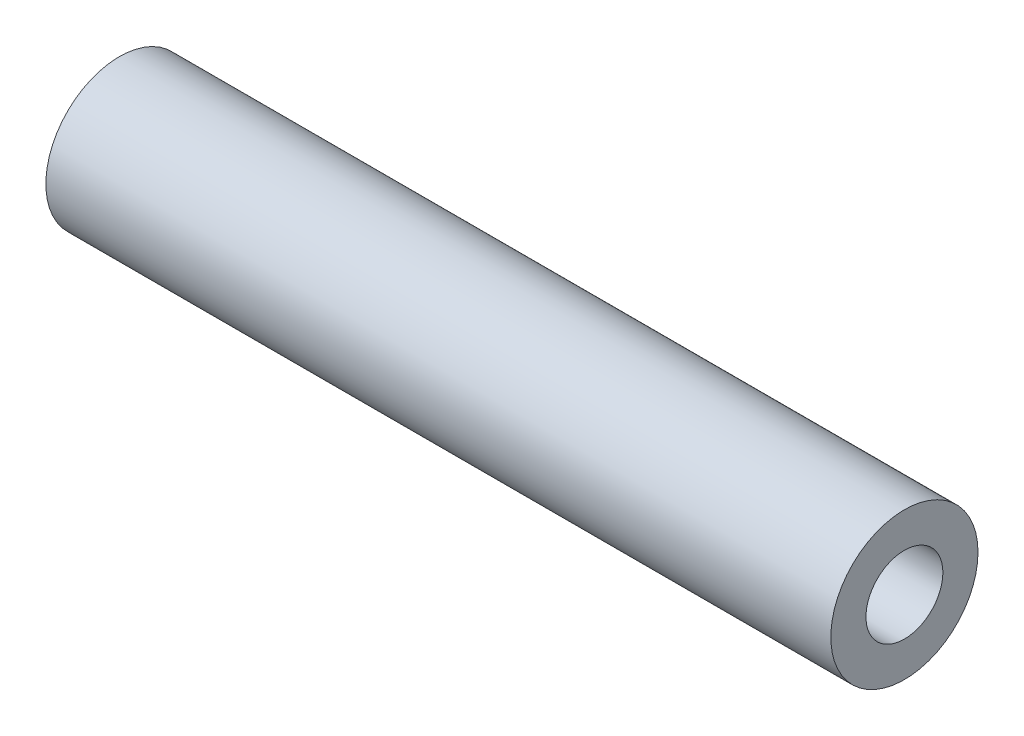
ISO-10303-21;
HEADER;
FILE_DESCRIPTION(('STEP AP214'),'2;1');
FILE_NAME('part.step','',(''),(''),'','','');
FILE_SCHEMA(('AUTOMOTIVE_DESIGN { 1 0 10303 214 1 1 1 1 }'));
ENDSEC;
DATA;
#1=APPLICATION_CONTEXT('core data for automotive mechanical design processes');
#2=APPLICATION_PROTOCOL_DEFINITION('international standard','automotive_design',2000,#1);
#3=PRODUCT_CONTEXT('',#1,'mechanical');
#4=PRODUCT('Part','Part','',(#3));
#5=PRODUCT_RELATED_PRODUCT_CATEGORY('part','',(#4));
#6=PRODUCT_DEFINITION_FORMATION('','',#4);
#7=PRODUCT_DEFINITION_CONTEXT('part definition',#1,'design');
#8=PRODUCT_DEFINITION('design','',#6,#7);
#9=PRODUCT_DEFINITION_SHAPE('','',#8);
#10=(LENGTH_UNIT() NAMED_UNIT(*) SI_UNIT(.MILLI.,.METRE.));
#11=(NAMED_UNIT(*) PLANE_ANGLE_UNIT() SI_UNIT($,.RADIAN.));
#12=(NAMED_UNIT(*) SI_UNIT($,.STERADIAN.) SOLID_ANGLE_UNIT());
#13=UNCERTAINTY_MEASURE_WITH_UNIT(LENGTH_MEASURE(1.E-05),#10,'distance_accuracy_value','');
#14=(GEOMETRIC_REPRESENTATION_CONTEXT(3) GLOBAL_UNCERTAINTY_ASSIGNED_CONTEXT((#13)) GLOBAL_UNIT_ASSIGNED_CONTEXT((#10,
#11,#12)) REPRESENTATION_CONTEXT('',''));
#15=CARTESIAN_POINT('',(0.,0.,0.));
#16=DIRECTION('',(0.,0.,1.));
#17=DIRECTION('',(1.,0.,0.));
#18=AXIS2_PLACEMENT_3D('',#15,#16,#17);
#19=CARTESIAN_POINT('',(25.4,0.,0.));
#20=DIRECTION('',(1.,0.,0.));
#21=DIRECTION('',(0.,0.,-1.));
#22=AXIS2_PLACEMENT_3D('',#19,#20,#21);
#23=PLANE('',#22);
#24=CARTESIAN_POINT('',(25.4,0.,0.));
#25=DIRECTION('',(1.,0.,0.));
#26=DIRECTION('',(0.,0.,-1.));
#27=AXIS2_PLACEMENT_3D('',#24,#25,#26);
#28=CIRCLE('',#27,4.7625);
#29=CARTESIAN_POINT('',(25.4,0.,-4.7625));
#30=VERTEX_POINT('',#29);
#31=EDGE_CURVE('E10',#30,#30,#28,.T.);
#32=ORIENTED_EDGE('',*,*,#31,.T.);
#33=EDGE_LOOP('',(#32));
#34=FACE_BOUND('',#33,.T.);
#35=CARTESIAN_POINT('',(25.4,0.,0.));
#36=DIRECTION('',(1.,0.,0.));
#37=DIRECTION('',(0.,0.,-1.));
#38=AXIS2_PLACEMENT_3D('',#35,#36,#37);
#39=CIRCLE('',#38,2.4892);
#40=CARTESIAN_POINT('',(25.4,0.,-2.4892));
#41=VERTEX_POINT('',#40);
#42=EDGE_CURVE('E46',#41,#41,#39,.T.);
#43=ORIENTED_EDGE('',*,*,#42,.F.);
#44=EDGE_LOOP('',(#43));
#45=FACE_BOUND('',#44,.T.);
#46=ADVANCED_FACE('F35',(#34,#45),#23,.T.);
#47=CARTESIAN_POINT('',(-25.4,0.,0.));
#48=DIRECTION('',(1.,0.,0.));
#49=DIRECTION('',(0.,0.,-1.));
#50=AXIS2_PLACEMENT_3D('',#47,#48,#49);
#51=PLANE('',#50);
#52=CARTESIAN_POINT('',(-25.4,0.,0.));
#53=DIRECTION('',(1.,0.,0.));
#54=DIRECTION('',(0.,0.,-1.));
#55=AXIS2_PLACEMENT_3D('',#52,#53,#54);
#56=CIRCLE('',#55,4.7625);
#57=CARTESIAN_POINT('',(-25.4,0.,-4.7625));
#58=VERTEX_POINT('',#57);
#59=EDGE_CURVE('E39',#58,#58,#56,.T.);
#60=ORIENTED_EDGE('',*,*,#59,.F.);
#61=EDGE_LOOP('',(#60));
#62=FACE_BOUND('',#61,.T.);
#63=CARTESIAN_POINT('',(-25.4,0.,0.));
#64=DIRECTION('',(1.,0.,0.));
#65=DIRECTION('',(0.,0.,-1.));
#66=AXIS2_PLACEMENT_3D('',#63,#64,#65);
#67=CIRCLE('',#66,2.4892);
#68=CARTESIAN_POINT('',(-25.4,0.,-2.4892));
#69=VERTEX_POINT('',#68);
#70=EDGE_CURVE('E48',#69,#69,#67,.T.);
#71=ORIENTED_EDGE('',*,*,#70,.T.);
#72=EDGE_LOOP('',(#71));
#73=FACE_BOUND('',#72,.T.);
#74=ADVANCED_FACE('F58',(#62,#73),#51,.F.);
#75=CARTESIAN_POINT('',(25.4,0.,0.));
#76=DIRECTION('',(-1.,0.,0.));
#77=DIRECTION('',(0.,0.,1.));
#78=AXIS2_PLACEMENT_3D('',#75,#76,#77);
#79=CYLINDRICAL_SURFACE('',#78,4.7625);
#80=ORIENTED_EDGE('',*,*,#31,.F.);
#81=EDGE_LOOP('',(#80));
#82=FACE_BOUND('',#81,.T.);
#83=ORIENTED_EDGE('',*,*,#59,.T.);
#84=EDGE_LOOP('',(#83));
#85=FACE_BOUND('',#84,.T.);
#86=ADVANCED_FACE('F37',(#82,#85),#79,.T.);
#87=CARTESIAN_POINT('',(25.4,0.,0.));
#88=DIRECTION('',(-1.,0.,0.));
#89=DIRECTION('',(0.,0.,1.));
#90=AXIS2_PLACEMENT_3D('',#87,#88,#89);
#91=CYLINDRICAL_SURFACE('',#90,2.4892);
#92=ORIENTED_EDGE('',*,*,#42,.T.);
#93=EDGE_LOOP('',(#92));
#94=FACE_BOUND('',#93,.T.);
#95=ORIENTED_EDGE('',*,*,#70,.F.);
#96=EDGE_LOOP('',(#95));
#97=FACE_BOUND('',#96,.T.);
#98=ADVANCED_FACE('F54',(#94,#97),#91,.F.);
#99=CLOSED_SHELL('',(#46,#74,#86,#98));
#100=MANIFOLD_SOLID_BREP('B2',#99);
#101=ADVANCED_BREP_SHAPE_REPRESENTATION('',(#18,#100),#14);
#102=SHAPE_DEFINITION_REPRESENTATION(#9,#101);
ENDSEC;
END-ISO-10303-21;
